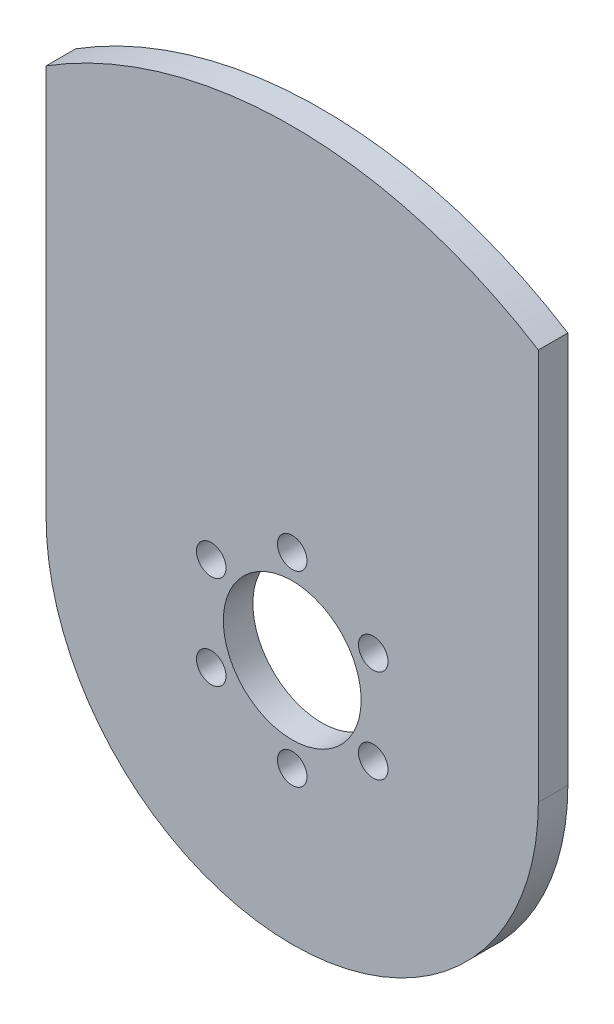
ISO-10303-21;
HEADER;
FILE_DESCRIPTION(('STEP AP214'),'2;1');
FILE_NAME('part.step','',(''),(''),'','','');
FILE_SCHEMA(('AUTOMOTIVE_DESIGN { 1 0 10303 214 1 1 1 1 }'));
ENDSEC;
DATA;
#1=APPLICATION_CONTEXT('core data for automotive mechanical design processes');
#2=APPLICATION_PROTOCOL_DEFINITION('international standard','automotive_design',2000,#1);
#3=PRODUCT_CONTEXT('',#1,'mechanical');
#4=PRODUCT('Part','Part','',(#3));
#5=PRODUCT_RELATED_PRODUCT_CATEGORY('part','',(#4));
#6=PRODUCT_DEFINITION_FORMATION('','',#4);
#7=PRODUCT_DEFINITION_CONTEXT('part definition',#1,'design');
#8=PRODUCT_DEFINITION('design','',#6,#7);
#9=PRODUCT_DEFINITION_SHAPE('','',#8);
#10=(LENGTH_UNIT() NAMED_UNIT(*) SI_UNIT(.MILLI.,.METRE.));
#11=(NAMED_UNIT(*) PLANE_ANGLE_UNIT() SI_UNIT($,.RADIAN.));
#12=(NAMED_UNIT(*) SI_UNIT($,.STERADIAN.) SOLID_ANGLE_UNIT());
#13=UNCERTAINTY_MEASURE_WITH_UNIT(LENGTH_MEASURE(1.E-05),#10,'distance_accuracy_value','');
#14=(GEOMETRIC_REPRESENTATION_CONTEXT(3) GLOBAL_UNCERTAINTY_ASSIGNED_CONTEXT((#13)) GLOBAL_UNIT_ASSIGNED_CONTEXT((#10,
#11,#12)) REPRESENTATION_CONTEXT('',''));
#15=CARTESIAN_POINT('',(0.,0.,0.));
#16=DIRECTION('',(0.,0.,1.));
#17=DIRECTION('',(1.,0.,0.));
#18=AXIS2_PLACEMENT_3D('',#15,#16,#17);
#19=CARTESIAN_POINT('',(0.,0.,3.));
#20=DIRECTION('',(0.,0.,-1.));
#21=DIRECTION('',(-1.,0.,0.));
#22=AXIS2_PLACEMENT_3D('',#19,#20,#21);
#23=CYLINDRICAL_SURFACE('',#22,47.);
#24=DIRECTION('',(0.,0.,1.));
#25=VECTOR('',#24,1.);
#26=CARTESIAN_POINT('',(25.,39.7994974842648,0.));
#27=LINE('',#26,#25);
#28=CARTESIAN_POINT('',(25.,39.7994974842648,0.));
#29=VERTEX_POINT('',#28);
#30=CARTESIAN_POINT('',(25.,39.7994974842648,3.));
#31=VERTEX_POINT('',#30);
#32=EDGE_CURVE('E204',#29,#31,#27,.T.);
#33=ORIENTED_EDGE('',*,*,#32,.F.);
#34=CARTESIAN_POINT('',(0.,0.,0.));
#35=DIRECTION('',(0.,0.,1.));
#36=DIRECTION('',(1.,0.,0.));
#37=AXIS2_PLACEMENT_3D('',#34,#35,#36);
#38=CIRCLE('',#37,47.);
#39=CARTESIAN_POINT('',(-25.,39.7994974842648,0.));
#40=VERTEX_POINT('',#39);
#41=EDGE_CURVE('E133',#29,#40,#38,.T.);
#42=ORIENTED_EDGE('',*,*,#41,.T.);
#43=DIRECTION('',(0.,0.,1.));
#44=VECTOR('',#43,1.);
#45=CARTESIAN_POINT('',(-25.,39.7994974842648,0.));
#46=LINE('',#45,#44);
#47=CARTESIAN_POINT('',(-25.,39.7994974842648,3.));
#48=VERTEX_POINT('',#47);
#49=EDGE_CURVE('E146',#40,#48,#46,.T.);
#50=ORIENTED_EDGE('',*,*,#49,.T.);
#51=CARTESIAN_POINT('',(0.,0.,3.));
#52=DIRECTION('',(0.,0.,1.));
#53=DIRECTION('',(1.,0.,0.));
#54=AXIS2_PLACEMENT_3D('',#51,#52,#53);
#55=CIRCLE('',#54,47.);
#56=EDGE_CURVE('E12',#31,#48,#55,.T.);
#57=ORIENTED_EDGE('',*,*,#56,.F.);
#58=EDGE_LOOP('',(#33,#42,#50,#57));
#59=FACE_BOUND('',#58,.T.);
#60=ADVANCED_FACE('F129',(#59),#23,.T.);
#61=CARTESIAN_POINT('',(0.,0.,3.));
#62=DIRECTION('',(0.,0.,1.));
#63=DIRECTION('',(1.,0.,0.));
#64=AXIS2_PLACEMENT_3D('',#61,#62,#63);
#65=PLANE('',#64);
#66=CARTESIAN_POINT('',(8.22724133595344,-4.74999999999926,3.));
#67=DIRECTION('',(0.,0.,1.));
#68=DIRECTION('',(1.,0.,0.));
#69=AXIS2_PLACEMENT_3D('',#66,#67,#68);
#70=CIRCLE('',#69,1.50000000000181);
#71=CARTESIAN_POINT('',(9.72724133595525,-4.74999999999926,3.));
#72=VERTEX_POINT('',#71);
#73=EDGE_CURVE('E270',#72,#72,#70,.T.);
#74=ORIENTED_EDGE('',*,*,#73,.F.);
#75=EDGE_LOOP('',(#74));
#76=FACE_BOUND('',#75,.T.);
#77=CARTESIAN_POINT('',(-8.22724133595175,4.74999999999926,3.));
#78=DIRECTION('',(0.,0.,1.));
#79=DIRECTION('',(1.,0.,0.));
#80=AXIS2_PLACEMENT_3D('',#77,#78,#79);
#81=CIRCLE('',#80,1.50000000000181);
#82=CARTESIAN_POINT('',(-6.72724133594993,4.74999999999926,3.));
#83=VERTEX_POINT('',#82);
#84=EDGE_CURVE('E281',#83,#83,#81,.T.);
#85=ORIENTED_EDGE('',*,*,#84,.F.);
#86=EDGE_LOOP('',(#85));
#87=FACE_BOUND('',#86,.T.);
#88=CARTESIAN_POINT('',(-8.22724133595089,-4.75000000000074,3.));
#89=DIRECTION('',(0.,0.,1.));
#90=DIRECTION('',(1.,0.,0.));
#91=AXIS2_PLACEMENT_3D('',#88,#89,#90);
#92=CIRCLE('',#91,1.50000000000181);
#93=CARTESIAN_POINT('',(-6.72724133594908,-4.75000000000074,3.));
#94=VERTEX_POINT('',#93);
#95=EDGE_CURVE('E194',#94,#94,#92,.T.);
#96=ORIENTED_EDGE('',*,*,#95,.F.);
#97=EDGE_LOOP('',(#96));
#98=FACE_BOUND('',#97,.T.);
#99=CARTESIAN_POINT('',(1.69911809948855E-12,-9.5,3.));
#100=DIRECTION('',(0.,0.,1.));
#101=DIRECTION('',(1.,0.,0.));
#102=AXIS2_PLACEMENT_3D('',#99,#100,#101);
#103=CIRCLE('',#102,1.50000000000181);
#104=CARTESIAN_POINT('',(1.50000000000351,-9.5,3.));
#105=VERTEX_POINT('',#104);
#106=EDGE_CURVE('E291',#105,#105,#103,.T.);
#107=ORIENTED_EDGE('',*,*,#106,.F.);
#108=EDGE_LOOP('',(#107));
#109=FACE_BOUND('',#108,.T.);
#110=CARTESIAN_POINT('',(0.,9.5,3.));
#111=DIRECTION('',(0.,0.,1.));
#112=DIRECTION('',(1.,0.,0.));
#113=AXIS2_PLACEMENT_3D('',#110,#111,#112);
#114=CIRCLE('',#113,1.50000000000181);
#115=CARTESIAN_POINT('',(1.50000000000181,9.5,3.));
#116=VERTEX_POINT('',#115);
#117=EDGE_CURVE('E266',#116,#116,#114,.T.);
#118=ORIENTED_EDGE('',*,*,#117,.F.);
#119=EDGE_LOOP('',(#118));
#120=FACE_BOUND('',#119,.T.);
#121=CARTESIAN_POINT('',(8.22724133595259,4.75000000000074,3.));
#122=DIRECTION('',(0.,0.,1.));
#123=DIRECTION('',(1.,0.,0.));
#124=AXIS2_PLACEMENT_3D('',#121,#122,#123);
#125=CIRCLE('',#124,1.50000000000181);
#126=CARTESIAN_POINT('',(9.7272413359544,4.75000000000074,3.));
#127=VERTEX_POINT('',#126);
#128=EDGE_CURVE('E273',#127,#127,#125,.T.);
#129=ORIENTED_EDGE('',*,*,#128,.F.);
#130=EDGE_LOOP('',(#129));
#131=FACE_BOUND('',#130,.T.);
#132=CARTESIAN_POINT('',(0.,0.,3.));
#133=DIRECTION('',(0.,0.,1.));
#134=DIRECTION('',(1.,0.,0.));
#135=AXIS2_PLACEMENT_3D('',#132,#133,#134);
#136=CIRCLE('',#135,7.);
#137=CARTESIAN_POINT('',(7.,0.,3.));
#138=VERTEX_POINT('',#137);
#139=EDGE_CURVE('E138',#138,#138,#136,.T.);
#140=ORIENTED_EDGE('',*,*,#139,.F.);
#141=EDGE_LOOP('',(#140));
#142=FACE_BOUND('',#141,.T.);
#143=CARTESIAN_POINT('',(0.,0.,3.));
#144=DIRECTION('',(0.,0.,1.));
#145=DIRECTION('',(1.,0.,0.));
#146=AXIS2_PLACEMENT_3D('',#143,#144,#145);
#147=CIRCLE('',#146,25.);
#148=CARTESIAN_POINT('',(-25.,0.,3.));
#149=VERTEX_POINT('',#148);
#150=CARTESIAN_POINT('',(25.,0.,3.));
#151=VERTEX_POINT('',#150);
#152=EDGE_CURVE('E178',#149,#151,#147,.T.);
#153=ORIENTED_EDGE('',*,*,#152,.T.);
#154=DIRECTION('',(0.,1.,0.));
#155=VECTOR('',#154,1.);
#156=CARTESIAN_POINT('',(25.,0.,3.));
#157=LINE('',#156,#155);
#158=EDGE_CURVE('E173',#151,#31,#157,.T.);
#159=ORIENTED_EDGE('',*,*,#158,.T.);
#160=ORIENTED_EDGE('',*,*,#56,.T.);
#161=DIRECTION('',(0.,1.,0.));
#162=VECTOR('',#161,1.);
#163=CARTESIAN_POINT('',(-25.,0.,3.));
#164=LINE('',#163,#162);
#165=EDGE_CURVE('E191',#149,#48,#164,.T.);
#166=ORIENTED_EDGE('',*,*,#165,.F.);
#167=EDGE_LOOP('',(#153,#159,#160,#166));
#168=FACE_BOUND('',#167,.T.);
#169=ADVANCED_FACE('F216',(#76,#87,#98,#109,#120,#131,#142,#168),#65,.T.);
#170=CARTESIAN_POINT('',(0.,0.,0.));
#171=DIRECTION('',(0.,0.,1.));
#172=DIRECTION('',(1.,0.,0.));
#173=AXIS2_PLACEMENT_3D('',#170,#171,#172);
#174=PLANE('',#173);
#175=CARTESIAN_POINT('',(8.22724133595344,-4.74999999999926,0.));
#176=DIRECTION('',(0.,0.,1.));
#177=DIRECTION('',(1.,0.,0.));
#178=AXIS2_PLACEMENT_3D('',#175,#176,#177);
#179=CIRCLE('',#178,1.50000000000181);
#180=CARTESIAN_POINT('',(9.72724133595525,-4.74999999999926,0.));
#181=VERTEX_POINT('',#180);
#182=EDGE_CURVE('E284',#181,#181,#179,.T.);
#183=ORIENTED_EDGE('',*,*,#182,.T.);
#184=EDGE_LOOP('',(#183));
#185=FACE_BOUND('',#184,.T.);
#186=CARTESIAN_POINT('',(-8.22724133595175,4.74999999999926,0.));
#187=DIRECTION('',(0.,0.,1.));
#188=DIRECTION('',(1.,0.,0.));
#189=AXIS2_PLACEMENT_3D('',#186,#187,#188);
#190=CIRCLE('',#189,1.50000000000181);
#191=CARTESIAN_POINT('',(-6.72724133594993,4.74999999999926,0.));
#192=VERTEX_POINT('',#191);
#193=EDGE_CURVE('E278',#192,#192,#190,.T.);
#194=ORIENTED_EDGE('',*,*,#193,.T.);
#195=EDGE_LOOP('',(#194));
#196=FACE_BOUND('',#195,.T.);
#197=CARTESIAN_POINT('',(-8.22724133595089,-4.75000000000074,0.));
#198=DIRECTION('',(0.,0.,1.));
#199=DIRECTION('',(1.,0.,0.));
#200=AXIS2_PLACEMENT_3D('',#197,#198,#199);
#201=CIRCLE('',#200,1.50000000000181);
#202=CARTESIAN_POINT('',(-6.72724133594908,-4.75000000000074,0.));
#203=VERTEX_POINT('',#202);
#204=EDGE_CURVE('E293',#203,#203,#201,.T.);
#205=ORIENTED_EDGE('',*,*,#204,.T.);
#206=EDGE_LOOP('',(#205));
#207=FACE_BOUND('',#206,.T.);
#208=CARTESIAN_POINT('',(1.69911809948855E-12,-9.5,0.));
#209=DIRECTION('',(0.,0.,1.));
#210=DIRECTION('',(1.,0.,0.));
#211=AXIS2_PLACEMENT_3D('',#208,#209,#210);
#212=CIRCLE('',#211,1.50000000000181);
#213=CARTESIAN_POINT('',(1.50000000000351,-9.5,0.));
#214=VERTEX_POINT('',#213);
#215=EDGE_CURVE('E199',#214,#214,#212,.T.);
#216=ORIENTED_EDGE('',*,*,#215,.T.);
#217=EDGE_LOOP('',(#216));
#218=FACE_BOUND('',#217,.T.);
#219=CARTESIAN_POINT('',(0.,9.5,0.));
#220=DIRECTION('',(0.,0.,1.));
#221=DIRECTION('',(1.,0.,0.));
#222=AXIS2_PLACEMENT_3D('',#219,#220,#221);
#223=CIRCLE('',#222,1.50000000000181);
#224=CARTESIAN_POINT('',(1.50000000000181,9.5,0.));
#225=VERTEX_POINT('',#224);
#226=EDGE_CURVE('E263',#225,#225,#223,.T.);
#227=ORIENTED_EDGE('',*,*,#226,.T.);
#228=EDGE_LOOP('',(#227));
#229=FACE_BOUND('',#228,.T.);
#230=CARTESIAN_POINT('',(8.22724133595259,4.75000000000074,0.));
#231=DIRECTION('',(0.,0.,1.));
#232=DIRECTION('',(1.,0.,0.));
#233=AXIS2_PLACEMENT_3D('',#230,#231,#232);
#234=CIRCLE('',#233,1.50000000000181);
#235=CARTESIAN_POINT('',(9.7272413359544,4.75000000000074,0.));
#236=VERTEX_POINT('',#235);
#237=EDGE_CURVE('E268',#236,#236,#234,.T.);
#238=ORIENTED_EDGE('',*,*,#237,.T.);
#239=EDGE_LOOP('',(#238));
#240=FACE_BOUND('',#239,.T.);
#241=CARTESIAN_POINT('',(0.,0.,0.));
#242=DIRECTION('',(0.,0.,1.));
#243=DIRECTION('',(1.,0.,0.));
#244=AXIS2_PLACEMENT_3D('',#241,#242,#243);
#245=CIRCLE('',#244,7.);
#246=CARTESIAN_POINT('',(7.,0.,0.));
#247=VERTEX_POINT('',#246);
#248=EDGE_CURVE('E203',#247,#247,#245,.T.);
#249=ORIENTED_EDGE('',*,*,#248,.T.);
#250=EDGE_LOOP('',(#249));
#251=FACE_BOUND('',#250,.T.);
#252=DIRECTION('',(0.,1.,0.));
#253=VECTOR('',#252,1.);
#254=CARTESIAN_POINT('',(25.,0.,0.));
#255=LINE('',#254,#253);
#256=CARTESIAN_POINT('',(25.,0.,0.));
#257=VERTEX_POINT('',#256);
#258=EDGE_CURVE('E180',#257,#29,#255,.T.);
#259=ORIENTED_EDGE('',*,*,#258,.F.);
#260=CARTESIAN_POINT('',(0.,0.,0.));
#261=DIRECTION('',(0.,0.,1.));
#262=DIRECTION('',(1.,0.,0.));
#263=AXIS2_PLACEMENT_3D('',#260,#261,#262);
#264=CIRCLE('',#263,25.);
#265=CARTESIAN_POINT('',(-25.,0.,0.));
#266=VERTEX_POINT('',#265);
#267=EDGE_CURVE('E155',#266,#257,#264,.T.);
#268=ORIENTED_EDGE('',*,*,#267,.F.);
#269=DIRECTION('',(0.,1.,0.));
#270=VECTOR('',#269,1.);
#271=CARTESIAN_POINT('',(-25.,0.,0.));
#272=LINE('',#271,#270);
#273=EDGE_CURVE('E182',#266,#40,#272,.T.);
#274=ORIENTED_EDGE('',*,*,#273,.T.);
#275=ORIENTED_EDGE('',*,*,#41,.F.);
#276=EDGE_LOOP('',(#259,#268,#274,#275));
#277=FACE_BOUND('',#276,.T.);
#278=ADVANCED_FACE('F189',(#185,#196,#207,#218,#229,#240,#251,#277),#174,.F.);
#279=CARTESIAN_POINT('',(0.,0.,3.));
#280=DIRECTION('',(0.,0.,-1.));
#281=DIRECTION('',(-1.,0.,0.));
#282=AXIS2_PLACEMENT_3D('',#279,#280,#281);
#283=CYLINDRICAL_SURFACE('',#282,7.);
#284=ORIENTED_EDGE('',*,*,#139,.T.);
#285=EDGE_LOOP('',(#284));
#286=FACE_BOUND('',#285,.T.);
#287=ORIENTED_EDGE('',*,*,#248,.F.);
#288=EDGE_LOOP('',(#287));
#289=FACE_BOUND('',#288,.T.);
#290=ADVANCED_FACE('F131',(#286,#289),#283,.F.);
#291=CARTESIAN_POINT('',(0.,0.,0.));
#292=DIRECTION('',(0.,0.,1.));
#293=DIRECTION('',(1.,0.,0.));
#294=AXIS2_PLACEMENT_3D('',#291,#292,#293);
#295=CYLINDRICAL_SURFACE('',#294,25.);
#296=ORIENTED_EDGE('',*,*,#152,.F.);
#297=DIRECTION('',(0.,0.,1.));
#298=VECTOR('',#297,1.);
#299=CARTESIAN_POINT('',(-25.,0.,0.));
#300=LINE('',#299,#298);
#301=EDGE_CURVE('E175',#266,#149,#300,.T.);
#302=ORIENTED_EDGE('',*,*,#301,.F.);
#303=ORIENTED_EDGE('',*,*,#267,.T.);
#304=DIRECTION('',(0.,0.,1.));
#305=VECTOR('',#304,1.);
#306=CARTESIAN_POINT('',(25.,0.,0.));
#307=LINE('',#306,#305);
#308=EDGE_CURVE('E201',#257,#151,#307,.T.);
#309=ORIENTED_EDGE('',*,*,#308,.T.);
#310=EDGE_LOOP('',(#296,#302,#303,#309));
#311=FACE_BOUND('',#310,.T.);
#312=ADVANCED_FACE('F176',(#311),#295,.T.);
#313=CARTESIAN_POINT('',(25.,0.,0.));
#314=DIRECTION('',(1.,0.,0.));
#315=DIRECTION('',(0.,0.,-1.));
#316=AXIS2_PLACEMENT_3D('',#313,#314,#315);
#317=PLANE('',#316);
#318=ORIENTED_EDGE('',*,*,#158,.F.);
#319=ORIENTED_EDGE('',*,*,#308,.F.);
#320=ORIENTED_EDGE('',*,*,#258,.T.);
#321=ORIENTED_EDGE('',*,*,#32,.T.);
#322=EDGE_LOOP('',(#318,#319,#320,#321));
#323=FACE_BOUND('',#322,.T.);
#324=ADVANCED_FACE('F214',(#323),#317,.T.);
#325=CARTESIAN_POINT('',(-25.,0.,0.));
#326=DIRECTION('',(1.,0.,0.));
#327=DIRECTION('',(0.,0.,-1.));
#328=AXIS2_PLACEMENT_3D('',#325,#326,#327);
#329=PLANE('',#328);
#330=ORIENTED_EDGE('',*,*,#165,.T.);
#331=ORIENTED_EDGE('',*,*,#49,.F.);
#332=ORIENTED_EDGE('',*,*,#273,.F.);
#333=ORIENTED_EDGE('',*,*,#301,.T.);
#334=EDGE_LOOP('',(#330,#331,#332,#333));
#335=FACE_BOUND('',#334,.T.);
#336=ADVANCED_FACE('F183',(#335),#329,.F.);
#337=CARTESIAN_POINT('',(8.22724133595259,4.75000000000074,0.));
#338=DIRECTION('',(0.,0.,1.));
#339=DIRECTION('',(1.,0.,0.));
#340=AXIS2_PLACEMENT_3D('',#337,#338,#339);
#341=CYLINDRICAL_SURFACE('',#340,1.50000000000181);
#342=ORIENTED_EDGE('',*,*,#237,.F.);
#343=EDGE_LOOP('',(#342));
#344=FACE_BOUND('',#343,.T.);
#345=ORIENTED_EDGE('',*,*,#128,.T.);
#346=EDGE_LOOP('',(#345));
#347=FACE_BOUND('',#346,.T.);
#348=ADVANCED_FACE('F233',(#344,#347),#341,.F.);
#349=CARTESIAN_POINT('',(0.,9.5,0.));
#350=DIRECTION('',(0.,0.,1.));
#351=DIRECTION('',(1.,0.,0.));
#352=AXIS2_PLACEMENT_3D('',#349,#350,#351);
#353=CYLINDRICAL_SURFACE('',#352,1.50000000000181);
#354=ORIENTED_EDGE('',*,*,#226,.F.);
#355=EDGE_LOOP('',(#354));
#356=FACE_BOUND('',#355,.T.);
#357=ORIENTED_EDGE('',*,*,#117,.T.);
#358=EDGE_LOOP('',(#357));
#359=FACE_BOUND('',#358,.T.);
#360=ADVANCED_FACE('F244',(#356,#359),#353,.F.);
#361=CARTESIAN_POINT('',(1.69911809948855E-12,-9.5,0.));
#362=DIRECTION('',(0.,0.,1.));
#363=DIRECTION('',(1.,0.,0.));
#364=AXIS2_PLACEMENT_3D('',#361,#362,#363);
#365=CYLINDRICAL_SURFACE('',#364,1.50000000000181);
#366=ORIENTED_EDGE('',*,*,#215,.F.);
#367=EDGE_LOOP('',(#366));
#368=FACE_BOUND('',#367,.T.);
#369=ORIENTED_EDGE('',*,*,#106,.T.);
#370=EDGE_LOOP('',(#369));
#371=FACE_BOUND('',#370,.T.);
#372=ADVANCED_FACE('F240',(#368,#371),#365,.F.);
#373=CARTESIAN_POINT('',(-8.22724133595089,-4.75000000000074,0.));
#374=DIRECTION('',(0.,0.,1.));
#375=DIRECTION('',(1.,0.,0.));
#376=AXIS2_PLACEMENT_3D('',#373,#374,#375);
#377=CYLINDRICAL_SURFACE('',#376,1.50000000000181);
#378=ORIENTED_EDGE('',*,*,#204,.F.);
#379=EDGE_LOOP('',(#378));
#380=FACE_BOUND('',#379,.T.);
#381=ORIENTED_EDGE('',*,*,#95,.T.);
#382=EDGE_LOOP('',(#381));
#383=FACE_BOUND('',#382,.T.);
#384=ADVANCED_FACE('F236',(#380,#383),#377,.F.);
#385=CARTESIAN_POINT('',(-8.22724133595175,4.74999999999926,0.));
#386=DIRECTION('',(0.,0.,1.));
#387=DIRECTION('',(1.,0.,0.));
#388=AXIS2_PLACEMENT_3D('',#385,#386,#387);
#389=CYLINDRICAL_SURFACE('',#388,1.50000000000181);
#390=ORIENTED_EDGE('',*,*,#193,.F.);
#391=EDGE_LOOP('',(#390));
#392=FACE_BOUND('',#391,.T.);
#393=ORIENTED_EDGE('',*,*,#84,.T.);
#394=EDGE_LOOP('',(#393));
#395=FACE_BOUND('',#394,.T.);
#396=ADVANCED_FACE('F239',(#392,#395),#389,.F.);
#397=CARTESIAN_POINT('',(8.22724133595344,-4.74999999999926,0.));
#398=DIRECTION('',(0.,0.,1.));
#399=DIRECTION('',(1.,0.,0.));
#400=AXIS2_PLACEMENT_3D('',#397,#398,#399);
#401=CYLINDRICAL_SURFACE('',#400,1.50000000000181);
#402=ORIENTED_EDGE('',*,*,#182,.F.);
#403=EDGE_LOOP('',(#402));
#404=FACE_BOUND('',#403,.T.);
#405=ORIENTED_EDGE('',*,*,#73,.T.);
#406=EDGE_LOOP('',(#405));
#407=FACE_BOUND('',#406,.T.);
#408=ADVANCED_FACE('F246',(#404,#407),#401,.F.);
#409=CLOSED_SHELL('',(#60,#169,#278,#290,#312,#324,#336,#348,#360,#372,#384,#396,#408));
#410=MANIFOLD_SOLID_BREP('B2',#409);
#411=ADVANCED_BREP_SHAPE_REPRESENTATION('',(#18,#410),#14);
#412=SHAPE_DEFINITION_REPRESENTATION(#9,#411);
ENDSEC;
END-ISO-10303-21;
